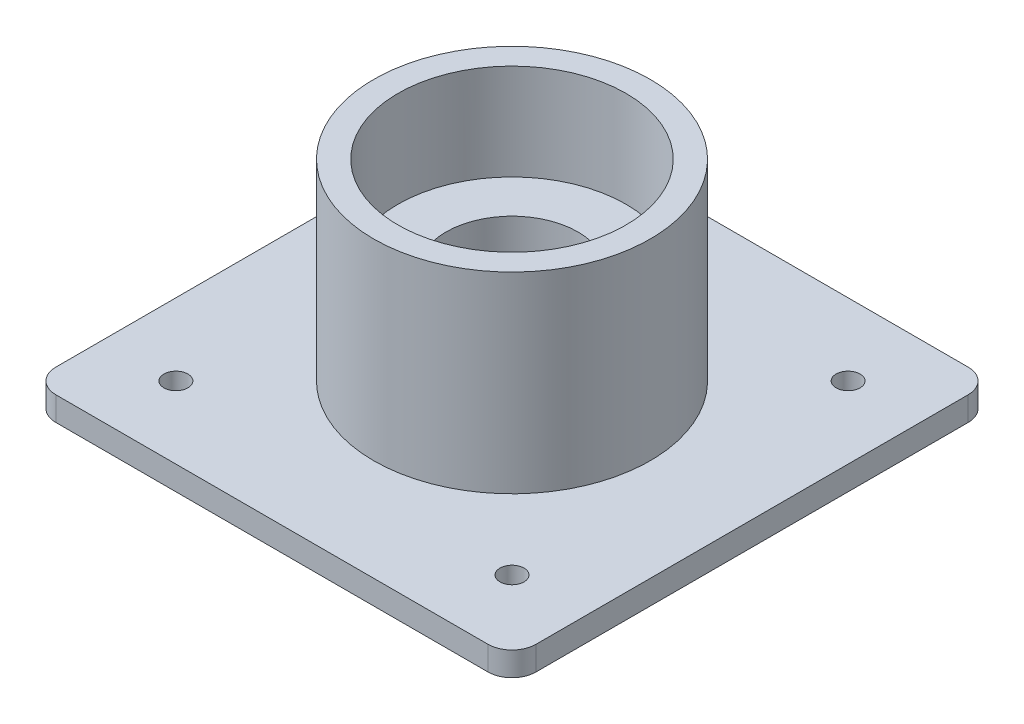
ISO-10303-21;
HEADER;
FILE_DESCRIPTION(('STEP AP214'),'2;1');
FILE_NAME('part.step','',(''),(''),'','','');
FILE_SCHEMA(('AUTOMOTIVE_DESIGN { 1 0 10303 214 1 1 1 1 }'));
ENDSEC;
DATA;
#1=APPLICATION_CONTEXT('core data for automotive mechanical design processes');
#2=APPLICATION_PROTOCOL_DEFINITION('international standard','automotive_design',2000,#1);
#3=PRODUCT_CONTEXT('',#1,'mechanical');
#4=PRODUCT('Part','Part','',(#3));
#5=PRODUCT_RELATED_PRODUCT_CATEGORY('part','',(#4));
#6=PRODUCT_DEFINITION_FORMATION('','',#4);
#7=PRODUCT_DEFINITION_CONTEXT('part definition',#1,'design');
#8=PRODUCT_DEFINITION('design','',#6,#7);
#9=PRODUCT_DEFINITION_SHAPE('','',#8);
#10=(LENGTH_UNIT() NAMED_UNIT(*) SI_UNIT(.MILLI.,.METRE.));
#11=(NAMED_UNIT(*) PLANE_ANGLE_UNIT() SI_UNIT($,.RADIAN.));
#12=(NAMED_UNIT(*) SI_UNIT($,.STERADIAN.) SOLID_ANGLE_UNIT());
#13=UNCERTAINTY_MEASURE_WITH_UNIT(LENGTH_MEASURE(1.E-05),#10,'distance_accuracy_value','');
#14=(GEOMETRIC_REPRESENTATION_CONTEXT(3) GLOBAL_UNCERTAINTY_ASSIGNED_CONTEXT((#13)) GLOBAL_UNIT_ASSIGNED_CONTEXT((#10,
#11,#12)) REPRESENTATION_CONTEXT('',''));
#15=CARTESIAN_POINT('',(0.,0.,0.));
#16=DIRECTION('',(0.,0.,1.));
#17=DIRECTION('',(1.,0.,0.));
#18=AXIS2_PLACEMENT_3D('',#15,#16,#17);
#19=CARTESIAN_POINT('',(0.,25.4,0.));
#20=DIRECTION('',(0.,1.,0.));
#21=DIRECTION('',(0.,0.,1.));
#22=AXIS2_PLACEMENT_3D('',#19,#20,#21);
#23=PLANE('',#22);
#24=CARTESIAN_POINT('',(0.,25.4,0.));
#25=DIRECTION('',(0.,1.,0.));
#26=DIRECTION('',(0.,0.,1.));
#27=AXIS2_PLACEMENT_3D('',#24,#25,#26);
#28=CIRCLE('',#27,30.1625);
#29=CARTESIAN_POINT('',(0.,25.4,30.1625));
#30=VERTEX_POINT('',#29);
#31=EDGE_CURVE('E144',#30,#30,#28,.T.);
#32=ORIENTED_EDGE('',*,*,#31,.T.);
#33=EDGE_LOOP('',(#32));
#34=FACE_BOUND('',#33,.T.);
#35=CARTESIAN_POINT('',(0.,25.4,0.));
#36=DIRECTION('',(0.,1.,0.));
#37=DIRECTION('',(0.,0.,1.));
#38=AXIS2_PLACEMENT_3D('',#35,#36,#37);
#39=CIRCLE('',#38,17.4625);
#40=CARTESIAN_POINT('',(0.,25.4,17.4625));
#41=VERTEX_POINT('',#40);
#42=EDGE_CURVE('E149',#41,#41,#39,.T.);
#43=ORIENTED_EDGE('',*,*,#42,.F.);
#44=EDGE_LOOP('',(#43));
#45=FACE_BOUND('',#44,.T.);
#46=ADVANCED_FACE('F33',(#34,#45),#23,.T.);
#47=CARTESIAN_POINT('',(0.,25.4,0.));
#48=DIRECTION('',(0.,-1.,0.));
#49=DIRECTION('',(0.,0.,-1.));
#50=AXIS2_PLACEMENT_3D('',#47,#48,#49);
#51=CYLINDRICAL_SURFACE('',#50,17.4625);
#52=ORIENTED_EDGE('',*,*,#42,.T.);
#53=EDGE_LOOP('',(#52));
#54=FACE_BOUND('',#53,.T.);
#55=CARTESIAN_POINT('',(0.,-6.35,0.));
#56=DIRECTION('',(0.,-1.,0.));
#57=DIRECTION('',(0.,0.,-1.));
#58=AXIS2_PLACEMENT_3D('',#55,#56,#57);
#59=CIRCLE('',#58,17.4625);
#60=CARTESIAN_POINT('',(0.,-6.35,-17.4625));
#61=VERTEX_POINT('',#60);
#62=EDGE_CURVE('E130',#61,#61,#59,.T.);
#63=ORIENTED_EDGE('',*,*,#62,.T.);
#64=EDGE_LOOP('',(#63));
#65=FACE_BOUND('',#64,.T.);
#66=ADVANCED_FACE('F242',(#54,#65),#51,.F.);
#67=CARTESIAN_POINT('',(0.,50.8,0.));
#68=DIRECTION('',(0.,-1.,0.));
#69=DIRECTION('',(0.,0.,-1.));
#70=AXIS2_PLACEMENT_3D('',#67,#68,#69);
#71=CYLINDRICAL_SURFACE('',#70,36.576);
#72=CARTESIAN_POINT('',(0.,50.8,0.));
#73=DIRECTION('',(0.,-1.,0.));
#74=DIRECTION('',(0.,0.,-1.));
#75=AXIS2_PLACEMENT_3D('',#72,#73,#74);
#76=CIRCLE('',#75,36.576);
#77=CARTESIAN_POINT('',(0.,50.8,-36.576));
#78=VERTEX_POINT('',#77);
#79=EDGE_CURVE('E141',#78,#78,#76,.T.);
#80=ORIENTED_EDGE('',*,*,#79,.T.);
#81=EDGE_LOOP('',(#80));
#82=FACE_BOUND('',#81,.T.);
#83=CARTESIAN_POINT('',(0.,0.,0.));
#84=DIRECTION('',(0.,-1.,0.));
#85=DIRECTION('',(0.,0.,-1.));
#86=AXIS2_PLACEMENT_3D('',#83,#84,#85);
#87=CIRCLE('',#86,36.576);
#88=CARTESIAN_POINT('',(0.,0.,-36.576));
#89=VERTEX_POINT('',#88);
#90=EDGE_CURVE('E139',#89,#89,#87,.T.);
#91=ORIENTED_EDGE('',*,*,#90,.F.);
#92=EDGE_LOOP('',(#91));
#93=FACE_BOUND('',#92,.T.);
#94=ADVANCED_FACE('F239',(#82,#93),#71,.T.);
#95=CARTESIAN_POINT('',(0.,50.8,0.));
#96=DIRECTION('',(0.,-1.,0.));
#97=DIRECTION('',(0.,0.,-1.));
#98=AXIS2_PLACEMENT_3D('',#95,#96,#97);
#99=PLANE('',#98);
#100=CARTESIAN_POINT('',(0.,50.8,0.));
#101=DIRECTION('',(0.,-1.,0.));
#102=DIRECTION('',(0.,0.,-1.));
#103=AXIS2_PLACEMENT_3D('',#100,#101,#102);
#104=CIRCLE('',#103,30.1625);
#105=CARTESIAN_POINT('',(0.,50.8,-30.1625));
#106=VERTEX_POINT('',#105);
#107=EDGE_CURVE('E136',#106,#106,#104,.T.);
#108=ORIENTED_EDGE('',*,*,#107,.T.);
#109=EDGE_LOOP('',(#108));
#110=FACE_BOUND('',#109,.T.);
#111=ORIENTED_EDGE('',*,*,#79,.F.);
#112=EDGE_LOOP('',(#111));
#113=FACE_BOUND('',#112,.T.);
#114=ADVANCED_FACE('F241',(#110,#113),#99,.F.);
#115=CARTESIAN_POINT('',(0.,50.8,0.));
#116=DIRECTION('',(0.,-1.,0.));
#117=DIRECTION('',(0.,0.,-1.));
#118=AXIS2_PLACEMENT_3D('',#115,#116,#117);
#119=CYLINDRICAL_SURFACE('',#118,30.1625);
#120=ORIENTED_EDGE('',*,*,#31,.F.);
#121=EDGE_LOOP('',(#120));
#122=FACE_BOUND('',#121,.T.);
#123=ORIENTED_EDGE('',*,*,#107,.F.);
#124=EDGE_LOOP('',(#123));
#125=FACE_BOUND('',#124,.T.);
#126=ADVANCED_FACE('F193',(#122,#125),#119,.F.);
#127=CARTESIAN_POINT('',(0.,-6.35,0.));
#128=DIRECTION('',(0.,1.,0.));
#129=DIRECTION('',(0.,0.,1.));
#130=AXIS2_PLACEMENT_3D('',#127,#128,#129);
#131=PLANE('',#130);
#132=CARTESIAN_POINT('',(44.4499999999995,-6.35,44.4500000000005));
#133=DIRECTION('',(0.,1.,0.));
#134=DIRECTION('',(0.,0.,1.));
#135=AXIS2_PLACEMENT_3D('',#132,#133,#134);
#136=CIRCLE('',#135,3.175);
#137=CARTESIAN_POINT('',(44.4499999999995,-6.35,47.6250000000005));
#138=VERTEX_POINT('',#137);
#139=EDGE_CURVE('E219',#138,#138,#136,.T.);
#140=ORIENTED_EDGE('',*,*,#139,.T.);
#141=EDGE_LOOP('',(#140));
#142=FACE_BOUND('',#141,.T.);
#143=CARTESIAN_POINT('',(44.45,-6.35,-44.45));
#144=DIRECTION('',(0.,1.,0.));
#145=DIRECTION('',(0.,0.,1.));
#146=AXIS2_PLACEMENT_3D('',#143,#144,#145);
#147=CIRCLE('',#146,3.175);
#148=CARTESIAN_POINT('',(44.45,-6.35,-41.275));
#149=VERTEX_POINT('',#148);
#150=EDGE_CURVE('E213',#149,#149,#147,.T.);
#151=ORIENTED_EDGE('',*,*,#150,.T.);
#152=EDGE_LOOP('',(#151));
#153=FACE_BOUND('',#152,.T.);
#154=CARTESIAN_POINT('',(-44.4499999999999,-6.35,-44.4500000000002));
#155=DIRECTION('',(0.,1.,0.));
#156=DIRECTION('',(0.,0.,1.));
#157=AXIS2_PLACEMENT_3D('',#154,#155,#156);
#158=CIRCLE('',#157,3.175);
#159=CARTESIAN_POINT('',(-44.4499999999999,-6.35,-41.2750000000002));
#160=VERTEX_POINT('',#159);
#161=EDGE_CURVE('E205',#160,#160,#158,.T.);
#162=ORIENTED_EDGE('',*,*,#161,.T.);
#163=EDGE_LOOP('',(#162));
#164=FACE_BOUND('',#163,.T.);
#165=CARTESIAN_POINT('',(-44.45,-6.35,44.45));
#166=DIRECTION('',(0.,1.,0.));
#167=DIRECTION('',(0.,0.,1.));
#168=AXIS2_PLACEMENT_3D('',#165,#166,#167);
#169=CIRCLE('',#168,3.175);
#170=CARTESIAN_POINT('',(-44.45,-6.35,47.625));
#171=VERTEX_POINT('',#170);
#172=EDGE_CURVE('E199',#171,#171,#169,.T.);
#173=ORIENTED_EDGE('',*,*,#172,.T.);
#174=EDGE_LOOP('',(#173));
#175=FACE_BOUND('',#174,.T.);
#176=DIRECTION('',(0.,0.,1.));
#177=VECTOR('',#176,1.);
#178=CARTESIAN_POINT('',(63.5,-6.35,-63.5));
#179=LINE('',#178,#177);
#180=CARTESIAN_POINT('',(63.5,-6.35,-57.15));
#181=VERTEX_POINT('',#180);
#182=CARTESIAN_POINT('',(63.5,-6.35,57.15));
#183=VERTEX_POINT('',#182);
#184=EDGE_CURVE('E135',#181,#183,#179,.T.);
#185=ORIENTED_EDGE('',*,*,#184,.T.);
#186=CARTESIAN_POINT('',(57.15,-6.35,57.15));
#187=DIRECTION('',(0.,1.,0.));
#188=DIRECTION('',(0.,0.,1.));
#189=AXIS2_PLACEMENT_3D('',#186,#187,#188);
#190=CIRCLE('',#189,6.35);
#191=CARTESIAN_POINT('',(57.15,-6.35,63.5));
#192=VERTEX_POINT('',#191);
#193=EDGE_CURVE('E165',#183,#192,#190,.F.);
#194=ORIENTED_EDGE('',*,*,#193,.T.);
#195=DIRECTION('',(-1.,0.,0.));
#196=VECTOR('',#195,1.);
#197=CARTESIAN_POINT('',(-63.5,-6.35,63.5));
#198=LINE('',#197,#196);
#199=CARTESIAN_POINT('',(-57.15,-6.35,63.5));
#200=VERTEX_POINT('',#199);
#201=EDGE_CURVE('E118',#192,#200,#198,.T.);
#202=ORIENTED_EDGE('',*,*,#201,.T.);
#203=CARTESIAN_POINT('',(-57.15,-6.35,57.15));
#204=DIRECTION('',(0.,1.,0.));
#205=DIRECTION('',(0.,0.,1.));
#206=AXIS2_PLACEMENT_3D('',#203,#204,#205);
#207=CIRCLE('',#206,6.35);
#208=CARTESIAN_POINT('',(-63.5,-6.35,57.15));
#209=VERTEX_POINT('',#208);
#210=EDGE_CURVE('E163',#200,#209,#207,.F.);
#211=ORIENTED_EDGE('',*,*,#210,.T.);
#212=DIRECTION('',(0.,0.,-1.));
#213=VECTOR('',#212,1.);
#214=CARTESIAN_POINT('',(-63.5,-6.35,-63.5));
#215=LINE('',#214,#213);
#216=CARTESIAN_POINT('',(-63.5,-6.35,-57.15));
#217=VERTEX_POINT('',#216);
#218=EDGE_CURVE('E185',#209,#217,#215,.T.);
#219=ORIENTED_EDGE('',*,*,#218,.T.);
#220=CARTESIAN_POINT('',(-57.15,-6.35,-57.15));
#221=DIRECTION('',(0.,1.,0.));
#222=DIRECTION('',(0.,0.,1.));
#223=AXIS2_PLACEMENT_3D('',#220,#221,#222);
#224=CIRCLE('',#223,6.35);
#225=CARTESIAN_POINT('',(-57.15,-6.35,-63.5));
#226=VERTEX_POINT('',#225);
#227=EDGE_CURVE('E53',#217,#226,#224,.F.);
#228=ORIENTED_EDGE('',*,*,#227,.T.);
#229=DIRECTION('',(1.,0.,0.));
#230=VECTOR('',#229,1.);
#231=CARTESIAN_POINT('',(-63.5,-6.35,-63.5));
#232=LINE('',#231,#230);
#233=CARTESIAN_POINT('',(57.15,-6.35,-63.5));
#234=VERTEX_POINT('',#233);
#235=EDGE_CURVE('E140',#226,#234,#232,.T.);
#236=ORIENTED_EDGE('',*,*,#235,.T.);
#237=CARTESIAN_POINT('',(57.15,-6.35,-57.15));
#238=DIRECTION('',(0.,1.,0.));
#239=DIRECTION('',(0.,0.,1.));
#240=AXIS2_PLACEMENT_3D('',#237,#238,#239);
#241=CIRCLE('',#240,6.35);
#242=EDGE_CURVE('E161',#234,#181,#241,.F.);
#243=ORIENTED_EDGE('',*,*,#242,.T.);
#244=EDGE_LOOP('',(#185,#194,#202,#211,#219,#228,#236,#243));
#245=FACE_BOUND('',#244,.T.);
#246=ORIENTED_EDGE('',*,*,#62,.F.);
#247=EDGE_LOOP('',(#246));
#248=FACE_BOUND('',#247,.T.);
#249=ADVANCED_FACE('F190',(#142,#153,#164,#175,#245,#248),#131,.F.);
#250=CARTESIAN_POINT('',(0.,0.,0.));
#251=DIRECTION('',(0.,1.,0.));
#252=DIRECTION('',(0.,0.,1.));
#253=AXIS2_PLACEMENT_3D('',#250,#251,#252);
#254=PLANE('',#253);
#255=CARTESIAN_POINT('',(44.4499999999995,0.,44.4500000000005));
#256=DIRECTION('',(0.,1.,0.));
#257=DIRECTION('',(0.,0.,1.));
#258=AXIS2_PLACEMENT_3D('',#255,#256,#257);
#259=CIRCLE('',#258,3.175);
#260=CARTESIAN_POINT('',(44.4499999999995,0.,47.6250000000005));
#261=VERTEX_POINT('',#260);
#262=EDGE_CURVE('E222',#261,#261,#259,.T.);
#263=ORIENTED_EDGE('',*,*,#262,.F.);
#264=EDGE_LOOP('',(#263));
#265=FACE_BOUND('',#264,.T.);
#266=CARTESIAN_POINT('',(44.45,0.,-44.45));
#267=DIRECTION('',(0.,1.,0.));
#268=DIRECTION('',(0.,0.,1.));
#269=AXIS2_PLACEMENT_3D('',#266,#267,#268);
#270=CIRCLE('',#269,3.175);
#271=CARTESIAN_POINT('',(44.45,0.,-41.275));
#272=VERTEX_POINT('',#271);
#273=EDGE_CURVE('E216',#272,#272,#270,.T.);
#274=ORIENTED_EDGE('',*,*,#273,.F.);
#275=EDGE_LOOP('',(#274));
#276=FACE_BOUND('',#275,.T.);
#277=CARTESIAN_POINT('',(-44.4499999999999,0.,-44.4500000000002));
#278=DIRECTION('',(0.,1.,0.));
#279=DIRECTION('',(0.,0.,1.));
#280=AXIS2_PLACEMENT_3D('',#277,#278,#279);
#281=CIRCLE('',#280,3.175);
#282=CARTESIAN_POINT('',(-44.4499999999999,0.,-41.2750000000002));
#283=VERTEX_POINT('',#282);
#284=EDGE_CURVE('E210',#283,#283,#281,.T.);
#285=ORIENTED_EDGE('',*,*,#284,.F.);
#286=EDGE_LOOP('',(#285));
#287=FACE_BOUND('',#286,.T.);
#288=CARTESIAN_POINT('',(-44.45,0.,44.45));
#289=DIRECTION('',(0.,1.,0.));
#290=DIRECTION('',(0.,0.,1.));
#291=AXIS2_PLACEMENT_3D('',#288,#289,#290);
#292=CIRCLE('',#291,3.175);
#293=CARTESIAN_POINT('',(-44.45,0.,47.625));
#294=VERTEX_POINT('',#293);
#295=EDGE_CURVE('E201',#294,#294,#292,.T.);
#296=ORIENTED_EDGE('',*,*,#295,.F.);
#297=EDGE_LOOP('',(#296));
#298=FACE_BOUND('',#297,.T.);
#299=ORIENTED_EDGE('',*,*,#90,.T.);
#300=EDGE_LOOP('',(#299));
#301=FACE_BOUND('',#300,.T.);
#302=DIRECTION('',(-1.,0.,0.));
#303=VECTOR('',#302,1.);
#304=CARTESIAN_POINT('',(-63.5,0.,63.5));
#305=LINE('',#304,#303);
#306=CARTESIAN_POINT('',(57.15,0.,63.5));
#307=VERTEX_POINT('',#306);
#308=CARTESIAN_POINT('',(-57.15,0.,63.5));
#309=VERTEX_POINT('',#308);
#310=EDGE_CURVE('E115',#307,#309,#305,.T.);
#311=ORIENTED_EDGE('',*,*,#310,.F.);
#312=CARTESIAN_POINT('',(57.15,0.,57.15));
#313=DIRECTION('',(0.,1.,0.));
#314=DIRECTION('',(0.,0.,1.));
#315=AXIS2_PLACEMENT_3D('',#312,#313,#314);
#316=CIRCLE('',#315,6.35);
#317=CARTESIAN_POINT('',(63.5,0.,57.15));
#318=VERTEX_POINT('',#317);
#319=EDGE_CURVE('E98',#307,#318,#316,.T.);
#320=ORIENTED_EDGE('',*,*,#319,.T.);
#321=DIRECTION('',(0.,0.,1.));
#322=VECTOR('',#321,1.);
#323=CARTESIAN_POINT('',(63.5,0.,-63.5));
#324=LINE('',#323,#322);
#325=CARTESIAN_POINT('',(63.5,0.,-57.15));
#326=VERTEX_POINT('',#325);
#327=EDGE_CURVE('E125',#326,#318,#324,.T.);
#328=ORIENTED_EDGE('',*,*,#327,.F.);
#329=CARTESIAN_POINT('',(57.15,0.,-57.15));
#330=DIRECTION('',(0.,1.,0.));
#331=DIRECTION('',(0.,0.,1.));
#332=AXIS2_PLACEMENT_3D('',#329,#330,#331);
#333=CIRCLE('',#332,6.35);
#334=CARTESIAN_POINT('',(57.15,0.,-63.5));
#335=VERTEX_POINT('',#334);
#336=EDGE_CURVE('E154',#326,#335,#333,.T.);
#337=ORIENTED_EDGE('',*,*,#336,.T.);
#338=DIRECTION('',(1.,0.,0.));
#339=VECTOR('',#338,1.);
#340=CARTESIAN_POINT('',(-63.5,0.,-63.5));
#341=LINE('',#340,#339);
#342=CARTESIAN_POINT('',(-57.15,0.,-63.5));
#343=VERTEX_POINT('',#342);
#344=EDGE_CURVE('E128',#343,#335,#341,.T.);
#345=ORIENTED_EDGE('',*,*,#344,.F.);
#346=CARTESIAN_POINT('',(-57.15,0.,-57.15));
#347=DIRECTION('',(0.,1.,0.));
#348=DIRECTION('',(0.,0.,1.));
#349=AXIS2_PLACEMENT_3D('',#346,#347,#348);
#350=CIRCLE('',#349,6.35);
#351=CARTESIAN_POINT('',(-63.5,0.,-57.15));
#352=VERTEX_POINT('',#351);
#353=EDGE_CURVE('E119',#343,#352,#350,.T.);
#354=ORIENTED_EDGE('',*,*,#353,.T.);
#355=DIRECTION('',(0.,0.,-1.));
#356=VECTOR('',#355,1.);
#357=CARTESIAN_POINT('',(-63.5,0.,-63.5));
#358=LINE('',#357,#356);
#359=CARTESIAN_POINT('',(-63.5,0.,57.15));
#360=VERTEX_POINT('',#359);
#361=EDGE_CURVE('E124',#360,#352,#358,.T.);
#362=ORIENTED_EDGE('',*,*,#361,.F.);
#363=CARTESIAN_POINT('',(-57.15,0.,57.15));
#364=DIRECTION('',(0.,1.,0.));
#365=DIRECTION('',(0.,0.,1.));
#366=AXIS2_PLACEMENT_3D('',#363,#364,#365);
#367=CIRCLE('',#366,6.35);
#368=EDGE_CURVE('E109',#360,#309,#367,.T.);
#369=ORIENTED_EDGE('',*,*,#368,.T.);
#370=EDGE_LOOP('',(#311,#320,#328,#337,#345,#354,#362,#369));
#371=FACE_BOUND('',#370,.T.);
#372=ADVANCED_FACE('F122',(#265,#276,#287,#298,#301,#371),#254,.T.);
#373=CARTESIAN_POINT('',(63.5,-6.35,-63.5));
#374=DIRECTION('',(-1.,0.,0.));
#375=DIRECTION('',(0.,0.,1.));
#376=AXIS2_PLACEMENT_3D('',#373,#374,#375);
#377=PLANE('',#376);
#378=ORIENTED_EDGE('',*,*,#327,.T.);
#379=DIRECTION('',(0.,1.,0.));
#380=VECTOR('',#379,1.);
#381=CARTESIAN_POINT('',(63.5,-6.35,57.15));
#382=LINE('',#381,#380);
#383=EDGE_CURVE('E103',#318,#183,#382,.F.);
#384=ORIENTED_EDGE('',*,*,#383,.T.);
#385=ORIENTED_EDGE('',*,*,#184,.F.);
#386=DIRECTION('',(0.,1.,0.));
#387=VECTOR('',#386,1.);
#388=CARTESIAN_POINT('',(63.5,-6.35,-57.15));
#389=LINE('',#388,#387);
#390=EDGE_CURVE('E108',#181,#326,#389,.T.);
#391=ORIENTED_EDGE('',*,*,#390,.T.);
#392=EDGE_LOOP('',(#378,#384,#385,#391));
#393=FACE_BOUND('',#392,.T.);
#394=ADVANCED_FACE('F182',(#393),#377,.F.);
#395=CARTESIAN_POINT('',(-63.5,-6.35,63.5));
#396=DIRECTION('',(0.,0.,-1.));
#397=DIRECTION('',(-1.,0.,0.));
#398=AXIS2_PLACEMENT_3D('',#395,#396,#397);
#399=PLANE('',#398);
#400=ORIENTED_EDGE('',*,*,#201,.F.);
#401=DIRECTION('',(0.,1.,0.));
#402=VECTOR('',#401,1.);
#403=CARTESIAN_POINT('',(57.15,-6.35,63.5));
#404=LINE('',#403,#402);
#405=EDGE_CURVE('E102',#192,#307,#404,.T.);
#406=ORIENTED_EDGE('',*,*,#405,.T.);
#407=ORIENTED_EDGE('',*,*,#310,.T.);
#408=DIRECTION('',(0.,1.,0.));
#409=VECTOR('',#408,1.);
#410=CARTESIAN_POINT('',(-57.15,-6.35,63.5));
#411=LINE('',#410,#409);
#412=EDGE_CURVE('E120',#309,#200,#411,.F.);
#413=ORIENTED_EDGE('',*,*,#412,.T.);
#414=EDGE_LOOP('',(#400,#406,#407,#413));
#415=FACE_BOUND('',#414,.T.);
#416=ADVANCED_FACE('F114',(#415),#399,.F.);
#417=CARTESIAN_POINT('',(-63.5,-6.35,-63.5));
#418=DIRECTION('',(1.,0.,0.));
#419=DIRECTION('',(0.,0.,-1.));
#420=AXIS2_PLACEMENT_3D('',#417,#418,#419);
#421=PLANE('',#420);
#422=ORIENTED_EDGE('',*,*,#218,.F.);
#423=DIRECTION('',(0.,1.,0.));
#424=VECTOR('',#423,1.);
#425=CARTESIAN_POINT('',(-63.5,-6.35,57.15));
#426=LINE('',#425,#424);
#427=EDGE_CURVE('E169',#209,#360,#426,.T.);
#428=ORIENTED_EDGE('',*,*,#427,.T.);
#429=ORIENTED_EDGE('',*,*,#361,.T.);
#430=DIRECTION('',(0.,1.,0.));
#431=VECTOR('',#430,1.);
#432=CARTESIAN_POINT('',(-63.5,-6.35,-57.15));
#433=LINE('',#432,#431);
#434=EDGE_CURVE('E167',#352,#217,#433,.F.);
#435=ORIENTED_EDGE('',*,*,#434,.T.);
#436=EDGE_LOOP('',(#422,#428,#429,#435));
#437=FACE_BOUND('',#436,.T.);
#438=ADVANCED_FACE('F279',(#437),#421,.F.);
#439=CARTESIAN_POINT('',(-63.5,-6.35,-63.5));
#440=DIRECTION('',(0.,0.,1.));
#441=DIRECTION('',(1.,0.,0.));
#442=AXIS2_PLACEMENT_3D('',#439,#440,#441);
#443=PLANE('',#442);
#444=ORIENTED_EDGE('',*,*,#344,.T.);
#445=DIRECTION('',(0.,1.,0.));
#446=VECTOR('',#445,1.);
#447=CARTESIAN_POINT('',(57.15,-6.35,-63.5));
#448=LINE('',#447,#446);
#449=EDGE_CURVE('E11',#335,#234,#448,.F.);
#450=ORIENTED_EDGE('',*,*,#449,.T.);
#451=ORIENTED_EDGE('',*,*,#235,.F.);
#452=DIRECTION('',(0.,1.,0.));
#453=VECTOR('',#452,1.);
#454=CARTESIAN_POINT('',(-57.15,-6.35,-63.5));
#455=LINE('',#454,#453);
#456=EDGE_CURVE('E41',#226,#343,#455,.T.);
#457=ORIENTED_EDGE('',*,*,#456,.T.);
#458=EDGE_LOOP('',(#444,#450,#451,#457));
#459=FACE_BOUND('',#458,.T.);
#460=ADVANCED_FACE('F174',(#459),#443,.F.);
#461=CARTESIAN_POINT('',(57.15,-6.35,57.15));
#462=DIRECTION('',(0.,1.,0.));
#463=DIRECTION('',(0.,0.,1.));
#464=AXIS2_PLACEMENT_3D('',#461,#462,#463);
#465=CYLINDRICAL_SURFACE('',#464,6.35);
#466=ORIENTED_EDGE('',*,*,#193,.F.);
#467=ORIENTED_EDGE('',*,*,#383,.F.);
#468=ORIENTED_EDGE('',*,*,#319,.F.);
#469=ORIENTED_EDGE('',*,*,#405,.F.);
#470=EDGE_LOOP('',(#466,#467,#468,#469));
#471=FACE_BOUND('',#470,.T.);
#472=ADVANCED_FACE('F101',(#471),#465,.T.);
#473=CARTESIAN_POINT('',(-57.15,-6.35,57.15));
#474=DIRECTION('',(0.,1.,0.));
#475=DIRECTION('',(0.,0.,1.));
#476=AXIS2_PLACEMENT_3D('',#473,#474,#475);
#477=CYLINDRICAL_SURFACE('',#476,6.35);
#478=ORIENTED_EDGE('',*,*,#210,.F.);
#479=ORIENTED_EDGE('',*,*,#412,.F.);
#480=ORIENTED_EDGE('',*,*,#368,.F.);
#481=ORIENTED_EDGE('',*,*,#427,.F.);
#482=EDGE_LOOP('',(#478,#479,#480,#481));
#483=FACE_BOUND('',#482,.T.);
#484=ADVANCED_FACE('F262',(#483),#477,.T.);
#485=CARTESIAN_POINT('',(57.15,-6.35,-57.15));
#486=DIRECTION('',(0.,1.,0.));
#487=DIRECTION('',(0.,0.,1.));
#488=AXIS2_PLACEMENT_3D('',#485,#486,#487);
#489=CYLINDRICAL_SURFACE('',#488,6.35);
#490=ORIENTED_EDGE('',*,*,#242,.F.);
#491=ORIENTED_EDGE('',*,*,#449,.F.);
#492=ORIENTED_EDGE('',*,*,#336,.F.);
#493=ORIENTED_EDGE('',*,*,#390,.F.);
#494=EDGE_LOOP('',(#490,#491,#492,#493));
#495=FACE_BOUND('',#494,.T.);
#496=ADVANCED_FACE('F179',(#495),#489,.T.);
#497=CARTESIAN_POINT('',(-57.15,-6.35,-57.15));
#498=DIRECTION('',(0.,1.,0.));
#499=DIRECTION('',(0.,0.,1.));
#500=AXIS2_PLACEMENT_3D('',#497,#498,#499);
#501=CYLINDRICAL_SURFACE('',#500,6.35);
#502=ORIENTED_EDGE('',*,*,#227,.F.);
#503=ORIENTED_EDGE('',*,*,#434,.F.);
#504=ORIENTED_EDGE('',*,*,#353,.F.);
#505=ORIENTED_EDGE('',*,*,#456,.F.);
#506=EDGE_LOOP('',(#502,#503,#504,#505));
#507=FACE_BOUND('',#506,.T.);
#508=ADVANCED_FACE('F35',(#507),#501,.T.);
#509=CARTESIAN_POINT('',(-44.45,0.,44.45));
#510=DIRECTION('',(0.,1.,0.));
#511=DIRECTION('',(0.,0.,1.));
#512=AXIS2_PLACEMENT_3D('',#509,#510,#511);
#513=CYLINDRICAL_SURFACE('',#512,3.175);
#514=ORIENTED_EDGE('',*,*,#172,.F.);
#515=EDGE_LOOP('',(#514));
#516=FACE_BOUND('',#515,.T.);
#517=ORIENTED_EDGE('',*,*,#295,.T.);
#518=EDGE_LOOP('',(#517));
#519=FACE_BOUND('',#518,.T.);
#520=ADVANCED_FACE('F269',(#516,#519),#513,.F.);
#521=CARTESIAN_POINT('',(-44.4499999999999,0.,-44.4500000000002));
#522=DIRECTION('',(0.,1.,0.));
#523=DIRECTION('',(0.,0.,1.));
#524=AXIS2_PLACEMENT_3D('',#521,#522,#523);
#525=CYLINDRICAL_SURFACE('',#524,3.175);
#526=ORIENTED_EDGE('',*,*,#161,.F.);
#527=EDGE_LOOP('',(#526));
#528=FACE_BOUND('',#527,.T.);
#529=ORIENTED_EDGE('',*,*,#284,.T.);
#530=EDGE_LOOP('',(#529));
#531=FACE_BOUND('',#530,.T.);
#532=ADVANCED_FACE('F273',(#528,#531),#525,.F.);
#533=CARTESIAN_POINT('',(44.45,0.,-44.45));
#534=DIRECTION('',(0.,1.,0.));
#535=DIRECTION('',(0.,0.,1.));
#536=AXIS2_PLACEMENT_3D('',#533,#534,#535);
#537=CYLINDRICAL_SURFACE('',#536,3.175);
#538=ORIENTED_EDGE('',*,*,#150,.F.);
#539=EDGE_LOOP('',(#538));
#540=FACE_BOUND('',#539,.T.);
#541=ORIENTED_EDGE('',*,*,#273,.T.);
#542=EDGE_LOOP('',(#541));
#543=FACE_BOUND('',#542,.T.);
#544=ADVANCED_FACE('F366',(#540,#543),#537,.F.);
#545=CARTESIAN_POINT('',(44.4499999999995,0.,44.4500000000005));
#546=DIRECTION('',(0.,1.,0.));
#547=DIRECTION('',(0.,0.,1.));
#548=AXIS2_PLACEMENT_3D('',#545,#546,#547);
#549=CYLINDRICAL_SURFACE('',#548,3.175);
#550=ORIENTED_EDGE('',*,*,#139,.F.);
#551=EDGE_LOOP('',(#550));
#552=FACE_BOUND('',#551,.T.);
#553=ORIENTED_EDGE('',*,*,#262,.T.);
#554=EDGE_LOOP('',(#553));
#555=FACE_BOUND('',#554,.T.);
#556=ADVANCED_FACE('F226',(#552,#555),#549,.F.);
#557=CLOSED_SHELL('',(#46,#66,#94,#114,#126,#249,#372,#394,#416,#438,#460,#472,#484,#496,#508,
#520,#532,#544,#556));
#558=MANIFOLD_SOLID_BREP('B2',#557);
#559=ADVANCED_BREP_SHAPE_REPRESENTATION('',(#18,#558),#14);
#560=SHAPE_DEFINITION_REPRESENTATION(#9,#559);
ENDSEC;
END-ISO-10303-21;
